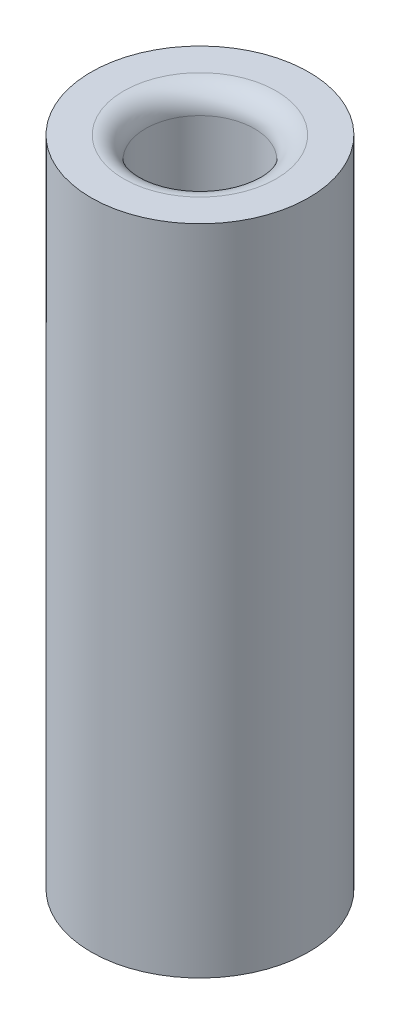
ISO-10303-21;
HEADER;
FILE_DESCRIPTION(('STEP AP214'),'2;1');
FILE_NAME('part.step','',(''),(''),'','','');
FILE_SCHEMA(('AUTOMOTIVE_DESIGN { 1 0 10303 214 1 1 1 1 }'));
ENDSEC;
DATA;
#1=APPLICATION_CONTEXT('core data for automotive mechanical design processes');
#2=APPLICATION_PROTOCOL_DEFINITION('international standard','automotive_design',2000,#1);
#3=PRODUCT_CONTEXT('',#1,'mechanical');
#4=PRODUCT('Part','Part','',(#3));
#5=PRODUCT_RELATED_PRODUCT_CATEGORY('part','',(#4));
#6=PRODUCT_DEFINITION_FORMATION('','',#4);
#7=PRODUCT_DEFINITION_CONTEXT('part definition',#1,'design');
#8=PRODUCT_DEFINITION('design','',#6,#7);
#9=PRODUCT_DEFINITION_SHAPE('','',#8);
#10=(LENGTH_UNIT() NAMED_UNIT(*) SI_UNIT(.MILLI.,.METRE.));
#11=(NAMED_UNIT(*) PLANE_ANGLE_UNIT() SI_UNIT($,.RADIAN.));
#12=(NAMED_UNIT(*) SI_UNIT($,.STERADIAN.) SOLID_ANGLE_UNIT());
#13=UNCERTAINTY_MEASURE_WITH_UNIT(LENGTH_MEASURE(1.E-05),#10,'distance_accuracy_value','');
#14=(GEOMETRIC_REPRESENTATION_CONTEXT(3) GLOBAL_UNCERTAINTY_ASSIGNED_CONTEXT((#13)) GLOBAL_UNIT_ASSIGNED_CONTEXT((#10,
#11,#12)) REPRESENTATION_CONTEXT('',''));
#15=CARTESIAN_POINT('',(0.,0.,0.));
#16=DIRECTION('',(0.,0.,1.));
#17=DIRECTION('',(1.,0.,0.));
#18=AXIS2_PLACEMENT_3D('',#15,#16,#17);
#19=CARTESIAN_POINT('',(0.,15.,0.));
#20=DIRECTION('',(0.,1.,0.));
#21=DIRECTION('',(0.,0.,1.));
#22=AXIS2_PLACEMENT_3D('',#19,#20,#21);
#23=PLANE('',#22);
#24=CARTESIAN_POINT('',(0.,15.,0.));
#25=DIRECTION('',(0.,1.,0.));
#26=DIRECTION('',(0.,0.,1.));
#27=AXIS2_PLACEMENT_3D('',#24,#25,#26);
#28=CIRCLE('',#27,1.75);
#29=CARTESIAN_POINT('',(0.,15.,1.75));
#30=VERTEX_POINT('',#29);
#31=EDGE_CURVE('E10',#30,#30,#28,.F.);
#32=ORIENTED_EDGE('',*,*,#31,.T.);
#33=EDGE_LOOP('',(#32));
#34=FACE_BOUND('',#33,.T.);
#35=CARTESIAN_POINT('',(0.,15.,0.));
#36=DIRECTION('',(0.,1.,0.));
#37=DIRECTION('',(0.,0.,1.));
#38=AXIS2_PLACEMENT_3D('',#35,#36,#37);
#39=CIRCLE('',#38,2.5);
#40=CARTESIAN_POINT('',(0.,15.,2.5));
#41=VERTEX_POINT('',#40);
#42=EDGE_CURVE('E55',#41,#41,#39,.T.);
#43=ORIENTED_EDGE('',*,*,#42,.T.);
#44=EDGE_LOOP('',(#43));
#45=FACE_BOUND('',#44,.T.);
#46=ADVANCED_FACE('F35',(#34,#45),#23,.T.);
#47=CARTESIAN_POINT('',(0.,0.,0.));
#48=DIRECTION('',(0.,1.,0.));
#49=DIRECTION('',(0.,0.,1.));
#50=AXIS2_PLACEMENT_3D('',#47,#48,#49);
#51=PLANE('',#50);
#52=CARTESIAN_POINT('',(0.,0.,0.));
#53=DIRECTION('',(0.,1.,0.));
#54=DIRECTION('',(0.,0.,1.));
#55=AXIS2_PLACEMENT_3D('',#52,#53,#54);
#56=CIRCLE('',#55,1.75);
#57=CARTESIAN_POINT('',(0.,0.,1.75));
#58=VERTEX_POINT('',#57);
#59=EDGE_CURVE('E50',#58,#58,#56,.T.);
#60=ORIENTED_EDGE('',*,*,#59,.T.);
#61=EDGE_LOOP('',(#60));
#62=FACE_BOUND('',#61,.T.);
#63=CARTESIAN_POINT('',(0.,0.,0.));
#64=DIRECTION('',(0.,1.,0.));
#65=DIRECTION('',(0.,0.,1.));
#66=AXIS2_PLACEMENT_3D('',#63,#64,#65);
#67=CIRCLE('',#66,2.5);
#68=CARTESIAN_POINT('',(0.,0.,2.5));
#69=VERTEX_POINT('',#68);
#70=EDGE_CURVE('E56',#69,#69,#67,.T.);
#71=ORIENTED_EDGE('',*,*,#70,.F.);
#72=EDGE_LOOP('',(#71));
#73=FACE_BOUND('',#72,.T.);
#74=ADVANCED_FACE('F67',(#62,#73),#51,.F.);
#75=CARTESIAN_POINT('',(0.,15.,0.));
#76=DIRECTION('',(0.,-1.,0.));
#77=DIRECTION('',(0.,0.,-1.));
#78=AXIS2_PLACEMENT_3D('',#75,#76,#77);
#79=CYLINDRICAL_SURFACE('',#78,2.5);
#80=ORIENTED_EDGE('',*,*,#42,.F.);
#81=EDGE_LOOP('',(#80));
#82=FACE_BOUND('',#81,.T.);
#83=ORIENTED_EDGE('',*,*,#70,.T.);
#84=EDGE_LOOP('',(#83));
#85=FACE_BOUND('',#84,.T.);
#86=ADVANCED_FACE('F63',(#82,#85),#79,.T.);
#87=CARTESIAN_POINT('',(0.,15.,0.));
#88=DIRECTION('',(0.,-1.,0.));
#89=DIRECTION('',(0.,0.,-1.));
#90=AXIS2_PLACEMENT_3D('',#87,#88,#89);
#91=CYLINDRICAL_SURFACE('',#90,1.25);
#92=CARTESIAN_POINT('',(0.,0.5,0.));
#93=DIRECTION('',(0.,1.,0.));
#94=DIRECTION('',(0.,0.,1.));
#95=AXIS2_PLACEMENT_3D('',#92,#93,#94);
#96=CIRCLE('',#95,1.25);
#97=CARTESIAN_POINT('',(0.,0.5,1.25));
#98=VERTEX_POINT('',#97);
#99=EDGE_CURVE('E42',#98,#98,#96,.F.);
#100=ORIENTED_EDGE('',*,*,#99,.T.);
#101=EDGE_LOOP('',(#100));
#102=FACE_BOUND('',#101,.T.);
#103=CARTESIAN_POINT('',(0.,14.5,0.));
#104=DIRECTION('',(0.,1.,0.));
#105=DIRECTION('',(0.,0.,1.));
#106=AXIS2_PLACEMENT_3D('',#103,#104,#105);
#107=CIRCLE('',#106,1.25);
#108=CARTESIAN_POINT('',(0.,14.5,1.25));
#109=VERTEX_POINT('',#108);
#110=EDGE_CURVE('E46',#109,#109,#107,.T.);
#111=ORIENTED_EDGE('',*,*,#110,.T.);
#112=EDGE_LOOP('',(#111));
#113=FACE_BOUND('',#112,.T.);
#114=ADVANCED_FACE('F66',(#102,#113),#91,.F.);
#115=CARTESIAN_POINT('',(0.,0.5,0.));
#116=DIRECTION('',(0.,1.,0.));
#117=DIRECTION('',(0.,0.,1.));
#118=AXIS2_PLACEMENT_3D('',#115,#116,#117);
#119=TOROIDAL_SURFACE('',#118,1.75,0.5);
#120=ORIENTED_EDGE('',*,*,#99,.F.);
#121=EDGE_LOOP('',(#120));
#122=FACE_BOUND('',#121,.T.);
#123=ORIENTED_EDGE('',*,*,#59,.F.);
#124=EDGE_LOOP('',(#123));
#125=FACE_BOUND('',#124,.T.);
#126=ADVANCED_FACE('F79',(#122,#125),#119,.T.);
#127=CARTESIAN_POINT('',(0.,14.5,0.));
#128=DIRECTION('',(0.,1.,0.));
#129=DIRECTION('',(0.,0.,1.));
#130=AXIS2_PLACEMENT_3D('',#127,#128,#129);
#131=TOROIDAL_SURFACE('',#130,1.75,0.5);
#132=ORIENTED_EDGE('',*,*,#31,.F.);
#133=EDGE_LOOP('',(#132));
#134=FACE_BOUND('',#133,.T.);
#135=ORIENTED_EDGE('',*,*,#110,.F.);
#136=EDGE_LOOP('',(#135));
#137=FACE_BOUND('',#136,.T.);
#138=ADVANCED_FACE('F37',(#134,#137),#131,.T.);
#139=CLOSED_SHELL('',(#46,#74,#86,#114,#126,#138));
#140=MANIFOLD_SOLID_BREP('B2',#139);
#141=ADVANCED_BREP_SHAPE_REPRESENTATION('',(#18,#140),#14);
#142=SHAPE_DEFINITION_REPRESENTATION(#9,#141);
ENDSEC;
END-ISO-10303-21;
